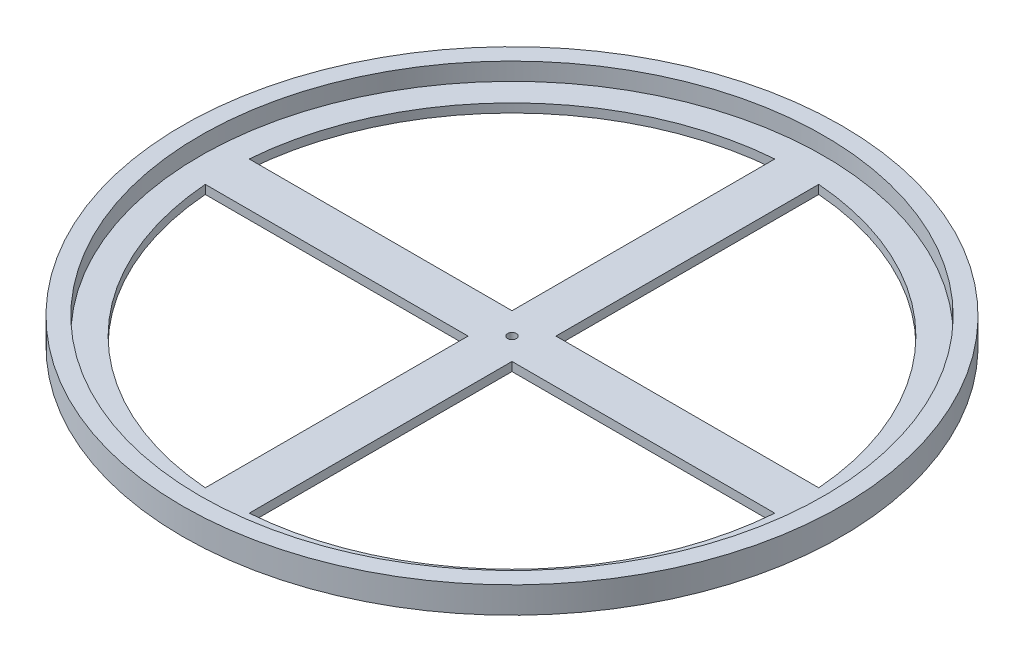
ISO-10303-21;
HEADER;
FILE_DESCRIPTION(('STEP AP214'),'2;1');
FILE_NAME('part.step','',(''),(''),'','','');
FILE_SCHEMA(('AUTOMOTIVE_DESIGN { 1 0 10303 214 1 1 1 1 }'));
ENDSEC;
DATA;
#1=APPLICATION_CONTEXT('core data for automotive mechanical design processes');
#2=APPLICATION_PROTOCOL_DEFINITION('international standard','automotive_design',2000,#1);
#3=PRODUCT_CONTEXT('',#1,'mechanical');
#4=PRODUCT('Part','Part','',(#3));
#5=PRODUCT_RELATED_PRODUCT_CATEGORY('part','',(#4));
#6=PRODUCT_DEFINITION_FORMATION('','',#4);
#7=PRODUCT_DEFINITION_CONTEXT('part definition',#1,'design');
#8=PRODUCT_DEFINITION('design','',#6,#7);
#9=PRODUCT_DEFINITION_SHAPE('','',#8);
#10=(LENGTH_UNIT() NAMED_UNIT(*) SI_UNIT(.MILLI.,.METRE.));
#11=(NAMED_UNIT(*) PLANE_ANGLE_UNIT() SI_UNIT($,.RADIAN.));
#12=(NAMED_UNIT(*) SI_UNIT($,.STERADIAN.) SOLID_ANGLE_UNIT());
#13=UNCERTAINTY_MEASURE_WITH_UNIT(LENGTH_MEASURE(1.E-05),#10,'distance_accuracy_value','');
#14=(GEOMETRIC_REPRESENTATION_CONTEXT(3) GLOBAL_UNCERTAINTY_ASSIGNED_CONTEXT((#13)) GLOBAL_UNIT_ASSIGNED_CONTEXT((#10,
#11,#12)) REPRESENTATION_CONTEXT('',''));
#15=CARTESIAN_POINT('',(0.,0.,0.));
#16=DIRECTION('',(0.,0.,1.));
#17=DIRECTION('',(1.,0.,0.));
#18=AXIS2_PLACEMENT_3D('',#15,#16,#17);
#19=CARTESIAN_POINT('',(0.,1.,0.));
#20=DIRECTION('',(0.,1.,0.));
#21=DIRECTION('',(0.,0.,1.));
#22=AXIS2_PLACEMENT_3D('',#19,#20,#21);
#23=PLANE('',#22);
#24=CARTESIAN_POINT('',(0.,1.,0.));
#25=DIRECTION('',(0.,1.,0.));
#26=DIRECTION('',(0.,0.,1.));
#27=AXIS2_PLACEMENT_3D('',#24,#25,#26);
#28=CIRCLE('',#27,0.5);
#29=CARTESIAN_POINT('',(0.,1.,0.5));
#30=VERTEX_POINT('',#29);
#31=EDGE_CURVE('E150',#30,#30,#28,.T.);
#32=ORIENTED_EDGE('',*,*,#31,.F.);
#33=EDGE_LOOP('',(#32));
#34=FACE_BOUND('',#33,.T.);
#35=DIRECTION('',(0.,0.,1.));
#36=VECTOR('',#35,1.);
#37=CARTESIAN_POINT('',(-2.5,1.,0.));
#38=LINE('',#37,#36);
#39=CARTESIAN_POINT('',(-2.5,1.,-32.4037034920393));
#40=VERTEX_POINT('',#39);
#41=CARTESIAN_POINT('',(-2.5,1.,-2.50000000000007));
#42=VERTEX_POINT('',#41);
#43=EDGE_CURVE('E135',#40,#42,#38,.T.);
#44=ORIENTED_EDGE('',*,*,#43,.T.);
#45=DIRECTION('',(1.,0.,0.));
#46=VECTOR('',#45,1.);
#47=CARTESIAN_POINT('',(0.,1.,-2.50000000000007));
#48=LINE('',#47,#46);
#49=CARTESIAN_POINT('',(-32.4037034920393,1.,-2.50000000000007));
#50=VERTEX_POINT('',#49);
#51=EDGE_CURVE('E139',#50,#42,#48,.T.);
#52=ORIENTED_EDGE('',*,*,#51,.F.);
#53=CARTESIAN_POINT('',(0.,1.,0.));
#54=DIRECTION('',(0.,1.,0.));
#55=DIRECTION('',(0.,0.,1.));
#56=AXIS2_PLACEMENT_3D('',#53,#54,#55);
#57=CIRCLE('',#56,32.5);
#58=EDGE_CURVE('E140',#40,#50,#57,.T.);
#59=ORIENTED_EDGE('',*,*,#58,.F.);
#60=EDGE_LOOP('',(#44,#52,#59));
#61=FACE_BOUND('',#60,.T.);
#62=DIRECTION('',(0.,0.,1.));
#63=VECTOR('',#62,1.);
#64=CARTESIAN_POINT('',(2.5,1.,0.));
#65=LINE('',#64,#63);
#66=CARTESIAN_POINT('',(2.5,1.,2.50000000000007));
#67=VERTEX_POINT('',#66);
#68=CARTESIAN_POINT('',(2.5,1.,32.4037034920393));
#69=VERTEX_POINT('',#68);
#70=EDGE_CURVE('E231',#67,#69,#65,.T.);
#71=ORIENTED_EDGE('',*,*,#70,.F.);
#72=DIRECTION('',(1.,0.,0.));
#73=VECTOR('',#72,1.);
#74=CARTESIAN_POINT('',(0.,1.,2.50000000000007));
#75=LINE('',#74,#73);
#76=CARTESIAN_POINT('',(32.4037034920393,1.,2.50000000000007));
#77=VERTEX_POINT('',#76);
#78=EDGE_CURVE('E235',#67,#77,#75,.T.);
#79=ORIENTED_EDGE('',*,*,#78,.T.);
#80=EDGE_CURVE('E141',#69,#77,#57,.T.);
#81=ORIENTED_EDGE('',*,*,#80,.F.);
#82=EDGE_LOOP('',(#71,#79,#81));
#83=FACE_BOUND('',#82,.T.);
#84=DIRECTION('',(1.,0.,0.));
#85=VECTOR('',#84,1.);
#86=CARTESIAN_POINT('',(0.,1.,-2.50000000000007));
#87=LINE('',#86,#85);
#88=CARTESIAN_POINT('',(2.5,1.,-2.50000000000007));
#89=VERTEX_POINT('',#88);
#90=CARTESIAN_POINT('',(32.4037034920393,1.,-2.50000000000007));
#91=VERTEX_POINT('',#90);
#92=EDGE_CURVE('E224',#89,#91,#87,.T.);
#93=ORIENTED_EDGE('',*,*,#92,.F.);
#94=DIRECTION('',(0.,0.,1.));
#95=VECTOR('',#94,1.);
#96=CARTESIAN_POINT('',(2.5,1.,0.));
#97=LINE('',#96,#95);
#98=CARTESIAN_POINT('',(2.5,1.,-32.4037034920393));
#99=VERTEX_POINT('',#98);
#100=EDGE_CURVE('E227',#99,#89,#97,.T.);
#101=ORIENTED_EDGE('',*,*,#100,.F.);
#102=EDGE_CURVE('E225',#91,#99,#57,.T.);
#103=ORIENTED_EDGE('',*,*,#102,.F.);
#104=EDGE_LOOP('',(#93,#101,#103));
#105=FACE_BOUND('',#104,.T.);
#106=DIRECTION('',(1.,0.,0.));
#107=VECTOR('',#106,1.);
#108=CARTESIAN_POINT('',(0.,1.,2.50000000000007));
#109=LINE('',#108,#107);
#110=CARTESIAN_POINT('',(-32.4037034920393,1.,2.50000000000007));
#111=VERTEX_POINT('',#110);
#112=CARTESIAN_POINT('',(-2.5,1.,2.50000000000007));
#113=VERTEX_POINT('',#112);
#114=EDGE_CURVE('E192',#111,#113,#109,.T.);
#115=ORIENTED_EDGE('',*,*,#114,.T.);
#116=DIRECTION('',(0.,0.,1.));
#117=VECTOR('',#116,1.);
#118=CARTESIAN_POINT('',(-2.5,1.,0.));
#119=LINE('',#118,#117);
#120=CARTESIAN_POINT('',(-2.5,1.,32.4037034920393));
#121=VERTEX_POINT('',#120);
#122=EDGE_CURVE('E107',#113,#121,#119,.T.);
#123=ORIENTED_EDGE('',*,*,#122,.T.);
#124=EDGE_CURVE('E152',#111,#121,#57,.T.);
#125=ORIENTED_EDGE('',*,*,#124,.F.);
#126=EDGE_LOOP('',(#115,#123,#125));
#127=FACE_BOUND('',#126,.T.);
#128=CARTESIAN_POINT('',(0.,1.,0.));
#129=DIRECTION('',(0.,1.,0.));
#130=DIRECTION('',(0.,0.,1.));
#131=AXIS2_PLACEMENT_3D('',#128,#129,#130);
#132=CIRCLE('',#131,35.5);
#133=CARTESIAN_POINT('',(0.,1.,35.5));
#134=VERTEX_POINT('',#133);
#135=EDGE_CURVE('E11',#134,#134,#132,.F.);
#136=ORIENTED_EDGE('',*,*,#135,.F.);
#137=EDGE_LOOP('',(#136));
#138=FACE_BOUND('',#137,.T.);
#139=ADVANCED_FACE('F39',(#34,#61,#83,#105,#127,#138),#23,.T.);
#140=CARTESIAN_POINT('',(-2.5,1.,0.));
#141=DIRECTION('',(1.,0.,0.));
#142=DIRECTION('',(0.,0.,-1.));
#143=AXIS2_PLACEMENT_3D('',#140,#141,#142);
#144=PLANE('',#143);
#145=DIRECTION('',(0.,0.,1.));
#146=VECTOR('',#145,1.);
#147=CARTESIAN_POINT('',(-2.5,0.,0.));
#148=LINE('',#147,#146);
#149=CARTESIAN_POINT('',(-2.5,0.,-32.4037034920393));
#150=VERTEX_POINT('',#149);
#151=CARTESIAN_POINT('',(-2.5,0.,-2.50000000000007));
#152=VERTEX_POINT('',#151);
#153=EDGE_CURVE('E144',#150,#152,#148,.T.);
#154=ORIENTED_EDGE('',*,*,#153,.T.);
#155=DIRECTION('',(0.,-1.,0.));
#156=VECTOR('',#155,1.);
#157=CARTESIAN_POINT('',(-2.5,1.,-2.50000000000007));
#158=LINE('',#157,#156);
#159=EDGE_CURVE('E48',#42,#152,#158,.T.);
#160=ORIENTED_EDGE('',*,*,#159,.F.);
#161=ORIENTED_EDGE('',*,*,#43,.F.);
#162=DIRECTION('',(0.,-1.,0.));
#163=VECTOR('',#162,1.);
#164=CARTESIAN_POINT('',(-2.5,1.,-32.4037034920393));
#165=LINE('',#164,#163);
#166=EDGE_CURVE('E56',#40,#150,#165,.T.);
#167=ORIENTED_EDGE('',*,*,#166,.T.);
#168=EDGE_LOOP('',(#154,#160,#161,#167));
#169=FACE_BOUND('',#168,.T.);
#170=ADVANCED_FACE('F143',(#169),#144,.F.);
#171=CARTESIAN_POINT('',(0.,1.,-2.50000000000007));
#172=DIRECTION('',(0.,0.,-1.));
#173=DIRECTION('',(-1.,0.,0.));
#174=AXIS2_PLACEMENT_3D('',#171,#172,#173);
#175=PLANE('',#174);
#176=DIRECTION('',(1.,0.,0.));
#177=VECTOR('',#176,1.);
#178=CARTESIAN_POINT('',(0.,0.,-2.50000000000007));
#179=LINE('',#178,#177);
#180=CARTESIAN_POINT('',(-32.4037034920393,0.,-2.50000000000007));
#181=VERTEX_POINT('',#180);
#182=EDGE_CURVE('E184',#181,#152,#179,.T.);
#183=ORIENTED_EDGE('',*,*,#182,.F.);
#184=DIRECTION('',(0.,-1.,0.));
#185=VECTOR('',#184,1.);
#186=CARTESIAN_POINT('',(-32.4037034920393,1.,-2.50000000000007));
#187=LINE('',#186,#185);
#188=EDGE_CURVE('E94',#50,#181,#187,.T.);
#189=ORIENTED_EDGE('',*,*,#188,.F.);
#190=ORIENTED_EDGE('',*,*,#51,.T.);
#191=ORIENTED_EDGE('',*,*,#159,.T.);
#192=EDGE_LOOP('',(#183,#189,#190,#191));
#193=FACE_BOUND('',#192,.T.);
#194=ADVANCED_FACE('F148',(#193),#175,.T.);
#195=CARTESIAN_POINT('',(2.5,1.,0.));
#196=DIRECTION('',(1.,0.,0.));
#197=DIRECTION('',(0.,0.,-1.));
#198=AXIS2_PLACEMENT_3D('',#195,#196,#197);
#199=PLANE('',#198);
#200=DIRECTION('',(0.,0.,1.));
#201=VECTOR('',#200,1.);
#202=CARTESIAN_POINT('',(2.5,0.,0.));
#203=LINE('',#202,#201);
#204=CARTESIAN_POINT('',(2.5,0.,2.50000000000007));
#205=VERTEX_POINT('',#204);
#206=CARTESIAN_POINT('',(2.5,0.,32.4037034920393));
#207=VERTEX_POINT('',#206);
#208=EDGE_CURVE('E176',#205,#207,#203,.T.);
#209=ORIENTED_EDGE('',*,*,#208,.F.);
#210=DIRECTION('',(0.,-1.,0.));
#211=VECTOR('',#210,1.);
#212=CARTESIAN_POINT('',(2.5,1.,2.50000000000007));
#213=LINE('',#212,#211);
#214=EDGE_CURVE('E194',#67,#205,#213,.T.);
#215=ORIENTED_EDGE('',*,*,#214,.F.);
#216=ORIENTED_EDGE('',*,*,#70,.T.);
#217=DIRECTION('',(0.,-1.,0.));
#218=VECTOR('',#217,1.);
#219=CARTESIAN_POINT('',(2.5,1.,32.4037034920393));
#220=LINE('',#219,#218);
#221=EDGE_CURVE('E196',#69,#207,#220,.T.);
#222=ORIENTED_EDGE('',*,*,#221,.T.);
#223=EDGE_LOOP('',(#209,#215,#216,#222));
#224=FACE_BOUND('',#223,.T.);
#225=ADVANCED_FACE('F413',(#224),#199,.T.);
#226=CARTESIAN_POINT('',(0.,1.,2.50000000000007));
#227=DIRECTION('',(0.,0.,-1.));
#228=DIRECTION('',(-1.,0.,0.));
#229=AXIS2_PLACEMENT_3D('',#226,#227,#228);
#230=PLANE('',#229);
#231=DIRECTION('',(1.,0.,0.));
#232=VECTOR('',#231,1.);
#233=CARTESIAN_POINT('',(0.,0.,2.50000000000007));
#234=LINE('',#233,#232);
#235=CARTESIAN_POINT('',(32.4037034920393,0.,2.50000000000007));
#236=VERTEX_POINT('',#235);
#237=EDGE_CURVE('E179',#205,#236,#234,.T.);
#238=ORIENTED_EDGE('',*,*,#237,.T.);
#239=DIRECTION('',(0.,-1.,0.));
#240=VECTOR('',#239,1.);
#241=CARTESIAN_POINT('',(32.4037034920393,1.,2.50000000000007));
#242=LINE('',#241,#240);
#243=EDGE_CURVE('E198',#77,#236,#242,.T.);
#244=ORIENTED_EDGE('',*,*,#243,.F.);
#245=ORIENTED_EDGE('',*,*,#78,.F.);
#246=ORIENTED_EDGE('',*,*,#214,.T.);
#247=EDGE_LOOP('',(#238,#244,#245,#246));
#248=FACE_BOUND('',#247,.T.);
#249=ADVANCED_FACE('F247',(#248),#230,.F.);
#250=CARTESIAN_POINT('',(0.,1.,-2.50000000000007));
#251=DIRECTION('',(0.,0.,-1.));
#252=DIRECTION('',(-1.,0.,0.));
#253=AXIS2_PLACEMENT_3D('',#250,#251,#252);
#254=PLANE('',#253);
#255=DIRECTION('',(1.,0.,0.));
#256=VECTOR('',#255,1.);
#257=CARTESIAN_POINT('',(0.,0.,-2.50000000000007));
#258=LINE('',#257,#256);
#259=CARTESIAN_POINT('',(2.5,0.,-2.50000000000007));
#260=VERTEX_POINT('',#259);
#261=CARTESIAN_POINT('',(32.4037034920393,0.,-2.50000000000007));
#262=VERTEX_POINT('',#261);
#263=EDGE_CURVE('E168',#260,#262,#258,.T.);
#264=ORIENTED_EDGE('',*,*,#263,.F.);
#265=DIRECTION('',(0.,-1.,0.));
#266=VECTOR('',#265,1.);
#267=CARTESIAN_POINT('',(2.5,1.,-2.50000000000007));
#268=LINE('',#267,#266);
#269=EDGE_CURVE('E199',#89,#260,#268,.T.);
#270=ORIENTED_EDGE('',*,*,#269,.F.);
#271=ORIENTED_EDGE('',*,*,#92,.T.);
#272=DIRECTION('',(0.,-1.,0.));
#273=VECTOR('',#272,1.);
#274=CARTESIAN_POINT('',(32.4037034920393,1.,-2.50000000000007));
#275=LINE('',#274,#273);
#276=EDGE_CURVE('E202',#91,#262,#275,.T.);
#277=ORIENTED_EDGE('',*,*,#276,.T.);
#278=EDGE_LOOP('',(#264,#270,#271,#277));
#279=FACE_BOUND('',#278,.T.);
#280=ADVANCED_FACE('F394',(#279),#254,.T.);
#281=CARTESIAN_POINT('',(2.5,1.,0.));
#282=DIRECTION('',(1.,0.,0.));
#283=DIRECTION('',(0.,0.,-1.));
#284=AXIS2_PLACEMENT_3D('',#281,#282,#283);
#285=PLANE('',#284);
#286=DIRECTION('',(0.,0.,1.));
#287=VECTOR('',#286,1.);
#288=CARTESIAN_POINT('',(2.5,0.,0.));
#289=LINE('',#288,#287);
#290=CARTESIAN_POINT('',(2.5,0.,-32.4037034920393));
#291=VERTEX_POINT('',#290);
#292=EDGE_CURVE('E173',#291,#260,#289,.T.);
#293=ORIENTED_EDGE('',*,*,#292,.F.);
#294=DIRECTION('',(0.,-1.,0.));
#295=VECTOR('',#294,1.);
#296=CARTESIAN_POINT('',(2.5,1.,-32.4037034920393));
#297=LINE('',#296,#295);
#298=EDGE_CURVE('E204',#99,#291,#297,.T.);
#299=ORIENTED_EDGE('',*,*,#298,.F.);
#300=ORIENTED_EDGE('',*,*,#100,.T.);
#301=ORIENTED_EDGE('',*,*,#269,.T.);
#302=EDGE_LOOP('',(#293,#299,#300,#301));
#303=FACE_BOUND('',#302,.T.);
#304=ADVANCED_FACE('F386',(#303),#285,.T.);
#305=CARTESIAN_POINT('',(0.,1.,2.50000000000007));
#306=DIRECTION('',(0.,0.,-1.));
#307=DIRECTION('',(-1.,0.,0.));
#308=AXIS2_PLACEMENT_3D('',#305,#306,#307);
#309=PLANE('',#308);
#310=DIRECTION('',(1.,0.,0.));
#311=VECTOR('',#310,1.);
#312=CARTESIAN_POINT('',(0.,0.,2.50000000000007));
#313=LINE('',#312,#311);
#314=CARTESIAN_POINT('',(-32.4037034920393,0.,2.50000000000007));
#315=VERTEX_POINT('',#314);
#316=CARTESIAN_POINT('',(-2.5,0.,2.50000000000007));
#317=VERTEX_POINT('',#316);
#318=EDGE_CURVE('E158',#315,#317,#313,.T.);
#319=ORIENTED_EDGE('',*,*,#318,.T.);
#320=DIRECTION('',(0.,-1.,0.));
#321=VECTOR('',#320,1.);
#322=CARTESIAN_POINT('',(-2.5,1.,2.50000000000007));
#323=LINE('',#322,#321);
#324=EDGE_CURVE('E205',#113,#317,#323,.T.);
#325=ORIENTED_EDGE('',*,*,#324,.F.);
#326=ORIENTED_EDGE('',*,*,#114,.F.);
#327=DIRECTION('',(0.,-1.,0.));
#328=VECTOR('',#327,1.);
#329=CARTESIAN_POINT('',(-32.4037034920393,1.,2.50000000000007));
#330=LINE('',#329,#328);
#331=EDGE_CURVE('E157',#111,#315,#330,.T.);
#332=ORIENTED_EDGE('',*,*,#331,.T.);
#333=EDGE_LOOP('',(#319,#325,#326,#332));
#334=FACE_BOUND('',#333,.T.);
#335=ADVANCED_FACE('F41',(#334),#309,.F.);
#336=CARTESIAN_POINT('',(-2.5,1.,0.));
#337=DIRECTION('',(1.,0.,0.));
#338=DIRECTION('',(0.,0.,-1.));
#339=AXIS2_PLACEMENT_3D('',#336,#337,#338);
#340=PLANE('',#339);
#341=DIRECTION('',(0.,0.,1.));
#342=VECTOR('',#341,1.);
#343=CARTESIAN_POINT('',(-2.5,0.,0.));
#344=LINE('',#343,#342);
#345=CARTESIAN_POINT('',(-2.5,0.,32.4037034920393));
#346=VERTEX_POINT('',#345);
#347=EDGE_CURVE('E161',#317,#346,#344,.T.);
#348=ORIENTED_EDGE('',*,*,#347,.T.);
#349=DIRECTION('',(0.,-1.,0.));
#350=VECTOR('',#349,1.);
#351=CARTESIAN_POINT('',(-2.5,1.,32.4037034920393));
#352=LINE('',#351,#350);
#353=EDGE_CURVE('E209',#121,#346,#352,.T.);
#354=ORIENTED_EDGE('',*,*,#353,.F.);
#355=ORIENTED_EDGE('',*,*,#122,.F.);
#356=ORIENTED_EDGE('',*,*,#324,.T.);
#357=EDGE_LOOP('',(#348,#354,#355,#356));
#358=FACE_BOUND('',#357,.T.);
#359=ADVANCED_FACE('F211',(#358),#340,.F.);
#360=CARTESIAN_POINT('',(0.,1.,0.));
#361=DIRECTION('',(0.,-1.,0.));
#362=DIRECTION('',(0.,0.,-1.));
#363=AXIS2_PLACEMENT_3D('',#360,#361,#362);
#364=CYLINDRICAL_SURFACE('',#363,37.5);
#365=CARTESIAN_POINT('',(0.,0.,0.));
#366=DIRECTION('',(0.,1.,0.));
#367=DIRECTION('',(0.,0.,1.));
#368=AXIS2_PLACEMENT_3D('',#365,#366,#367);
#369=CIRCLE('',#368,37.5);
#370=CARTESIAN_POINT('',(0.,0.,37.5));
#371=VERTEX_POINT('',#370);
#372=EDGE_CURVE('E186',#371,#371,#369,.T.);
#373=ORIENTED_EDGE('',*,*,#372,.T.);
#374=EDGE_LOOP('',(#373));
#375=FACE_BOUND('',#374,.T.);
#376=CARTESIAN_POINT('',(0.,3.,0.));
#377=DIRECTION('',(0.,1.,0.));
#378=DIRECTION('',(0.,0.,1.));
#379=AXIS2_PLACEMENT_3D('',#376,#377,#378);
#380=CIRCLE('',#379,37.5);
#381=CARTESIAN_POINT('',(0.,3.,37.5));
#382=VERTEX_POINT('',#381);
#383=EDGE_CURVE('E162',#382,#382,#380,.T.);
#384=ORIENTED_EDGE('',*,*,#383,.F.);
#385=EDGE_LOOP('',(#384));
#386=FACE_BOUND('',#385,.T.);
#387=ADVANCED_FACE('F259',(#375,#386),#364,.T.);
#388=CARTESIAN_POINT('',(0.,1.,0.));
#389=DIRECTION('',(0.,-1.,0.));
#390=DIRECTION('',(0.,0.,-1.));
#391=AXIS2_PLACEMENT_3D('',#388,#389,#390);
#392=CYLINDRICAL_SURFACE('',#391,32.5);
#393=CARTESIAN_POINT('',(0.,0.,0.));
#394=DIRECTION('',(0.,1.,0.));
#395=DIRECTION('',(0.,0.,1.));
#396=AXIS2_PLACEMENT_3D('',#393,#394,#395);
#397=CIRCLE('',#396,32.5);
#398=EDGE_CURVE('E169',#150,#181,#397,.T.);
#399=ORIENTED_EDGE('',*,*,#398,.F.);
#400=ORIENTED_EDGE('',*,*,#166,.F.);
#401=ORIENTED_EDGE('',*,*,#58,.T.);
#402=ORIENTED_EDGE('',*,*,#188,.T.);
#403=EDGE_LOOP('',(#399,#400,#401,#402));
#404=FACE_BOUND('',#403,.T.);
#405=ADVANCED_FACE('F257',(#404),#392,.F.);
#406=EDGE_CURVE('E182',#207,#236,#397,.T.);
#407=ORIENTED_EDGE('',*,*,#406,.F.);
#408=ORIENTED_EDGE('',*,*,#221,.F.);
#409=ORIENTED_EDGE('',*,*,#80,.T.);
#410=ORIENTED_EDGE('',*,*,#243,.T.);
#411=EDGE_LOOP('',(#407,#408,#409,#410));
#412=FACE_BOUND('',#411,.T.);
#413=ADVANCED_FACE('F251',(#412),#392,.F.);
#414=EDGE_CURVE('E170',#262,#291,#397,.T.);
#415=ORIENTED_EDGE('',*,*,#414,.F.);
#416=ORIENTED_EDGE('',*,*,#276,.F.);
#417=ORIENTED_EDGE('',*,*,#102,.T.);
#418=ORIENTED_EDGE('',*,*,#298,.T.);
#419=EDGE_LOOP('',(#415,#416,#417,#418));
#420=FACE_BOUND('',#419,.T.);
#421=ADVANCED_FACE('F265',(#420),#392,.F.);
#422=EDGE_CURVE('E165',#315,#346,#397,.T.);
#423=ORIENTED_EDGE('',*,*,#422,.F.);
#424=ORIENTED_EDGE('',*,*,#331,.F.);
#425=ORIENTED_EDGE('',*,*,#124,.T.);
#426=ORIENTED_EDGE('',*,*,#353,.T.);
#427=EDGE_LOOP('',(#423,#424,#425,#426));
#428=FACE_BOUND('',#427,.T.);
#429=ADVANCED_FACE('F220',(#428),#392,.F.);
#430=CARTESIAN_POINT('',(0.,1.,0.));
#431=DIRECTION('',(0.,-1.,0.));
#432=DIRECTION('',(0.,0.,-1.));
#433=AXIS2_PLACEMENT_3D('',#430,#431,#432);
#434=CYLINDRICAL_SURFACE('',#433,0.5);
#435=ORIENTED_EDGE('',*,*,#31,.T.);
#436=EDGE_LOOP('',(#435));
#437=FACE_BOUND('',#436,.T.);
#438=CARTESIAN_POINT('',(0.,0.,0.));
#439=DIRECTION('',(0.,1.,0.));
#440=DIRECTION('',(0.,0.,1.));
#441=AXIS2_PLACEMENT_3D('',#438,#439,#440);
#442=CIRCLE('',#441,0.5);
#443=CARTESIAN_POINT('',(0.,0.,0.5));
#444=VERTEX_POINT('',#443);
#445=EDGE_CURVE('E189',#444,#444,#442,.T.);
#446=ORIENTED_EDGE('',*,*,#445,.F.);
#447=EDGE_LOOP('',(#446));
#448=FACE_BOUND('',#447,.T.);
#449=ADVANCED_FACE('F270',(#437,#448),#434,.F.);
#450=CARTESIAN_POINT('',(0.,0.,0.));
#451=DIRECTION('',(0.,1.,0.));
#452=DIRECTION('',(0.,0.,1.));
#453=AXIS2_PLACEMENT_3D('',#450,#451,#452);
#454=PLANE('',#453);
#455=ORIENTED_EDGE('',*,*,#318,.F.);
#456=ORIENTED_EDGE('',*,*,#422,.T.);
#457=ORIENTED_EDGE('',*,*,#347,.F.);
#458=EDGE_LOOP('',(#455,#456,#457));
#459=FACE_BOUND('',#458,.T.);
#460=ORIENTED_EDGE('',*,*,#263,.T.);
#461=ORIENTED_EDGE('',*,*,#414,.T.);
#462=ORIENTED_EDGE('',*,*,#292,.T.);
#463=EDGE_LOOP('',(#460,#461,#462));
#464=FACE_BOUND('',#463,.T.);
#465=ORIENTED_EDGE('',*,*,#208,.T.);
#466=ORIENTED_EDGE('',*,*,#406,.T.);
#467=ORIENTED_EDGE('',*,*,#237,.F.);
#468=EDGE_LOOP('',(#465,#466,#467));
#469=FACE_BOUND('',#468,.T.);
#470=ORIENTED_EDGE('',*,*,#153,.F.);
#471=ORIENTED_EDGE('',*,*,#398,.T.);
#472=ORIENTED_EDGE('',*,*,#182,.T.);
#473=EDGE_LOOP('',(#470,#471,#472));
#474=FACE_BOUND('',#473,.T.);
#475=ORIENTED_EDGE('',*,*,#372,.F.);
#476=EDGE_LOOP('',(#475));
#477=FACE_BOUND('',#476,.T.);
#478=ORIENTED_EDGE('',*,*,#445,.T.);
#479=EDGE_LOOP('',(#478));
#480=FACE_BOUND('',#479,.T.);
#481=ADVANCED_FACE('F217',(#459,#464,#469,#474,#477,#480),#454,.F.);
#482=CARTESIAN_POINT('',(0.,3.,0.));
#483=DIRECTION('',(0.,1.,0.));
#484=DIRECTION('',(0.,0.,1.));
#485=AXIS2_PLACEMENT_3D('',#482,#483,#484);
#486=PLANE('',#485);
#487=ORIENTED_EDGE('',*,*,#383,.T.);
#488=EDGE_LOOP('',(#487));
#489=FACE_BOUND('',#488,.T.);
#490=CARTESIAN_POINT('',(0.,3.,0.));
#491=DIRECTION('',(0.,1.,0.));
#492=DIRECTION('',(0.,0.,1.));
#493=AXIS2_PLACEMENT_3D('',#490,#491,#492);
#494=CIRCLE('',#493,35.5);
#495=CARTESIAN_POINT('',(0.,3.,35.5));
#496=VERTEX_POINT('',#495);
#497=EDGE_CURVE('E475',#496,#496,#494,.T.);
#498=ORIENTED_EDGE('',*,*,#497,.F.);
#499=EDGE_LOOP('',(#498));
#500=FACE_BOUND('',#499,.T.);
#501=ADVANCED_FACE('F281',(#489,#500),#486,.T.);
#502=CARTESIAN_POINT('',(0.,3.,0.));
#503=DIRECTION('',(0.,-1.,0.));
#504=DIRECTION('',(0.,0.,-1.));
#505=AXIS2_PLACEMENT_3D('',#502,#503,#504);
#506=CYLINDRICAL_SURFACE('',#505,35.5);
#507=ORIENTED_EDGE('',*,*,#497,.T.);
#508=EDGE_LOOP('',(#507));
#509=FACE_BOUND('',#508,.T.);
#510=ORIENTED_EDGE('',*,*,#135,.T.);
#511=EDGE_LOOP('',(#510));
#512=FACE_BOUND('',#511,.T.);
#513=ADVANCED_FACE('F305',(#509,#512),#506,.F.);
#514=CLOSED_SHELL('',(#139,#170,#194,#225,#249,#280,#304,#335,#359,#387,#405,#413,#421,#429,
#449,#481,#501,#513));
#515=MANIFOLD_SOLID_BREP('B2',#514);
#516=ADVANCED_BREP_SHAPE_REPRESENTATION('',(#18,#515),#14);
#517=SHAPE_DEFINITION_REPRESENTATION(#9,#516);
ENDSEC;
END-ISO-10303-21;
